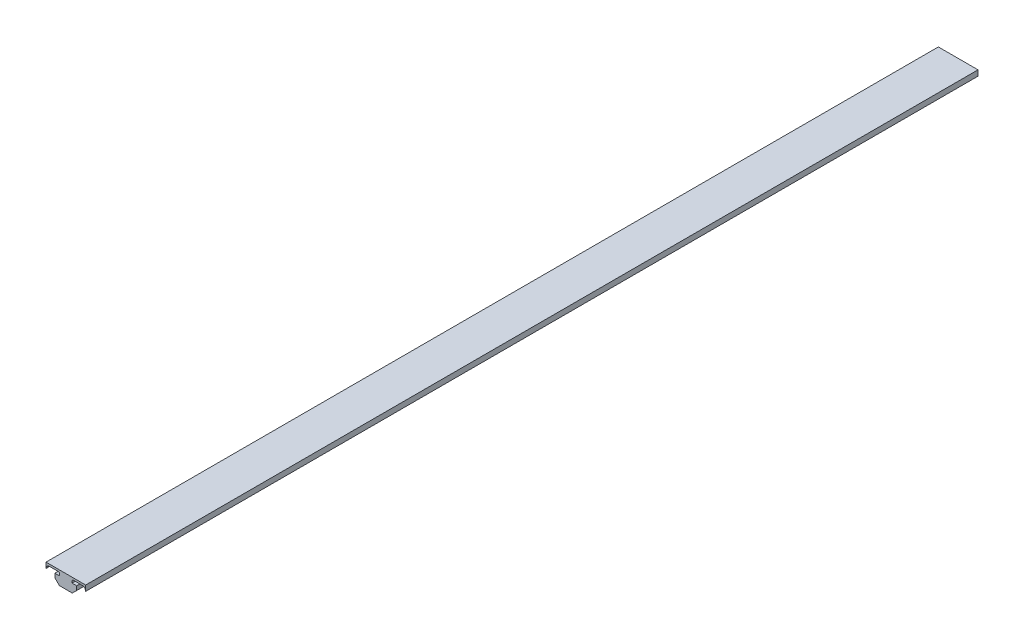
ISO-10303-21;
HEADER;
FILE_DESCRIPTION(('STEP AP214'),'2;1');
FILE_NAME('part.step','',(''),(''),'','','');
FILE_SCHEMA(('AUTOMOTIVE_DESIGN { 1 0 10303 214 1 1 1 1 }'));
ENDSEC;
DATA;
#1=APPLICATION_CONTEXT('core data for automotive mechanical design processes');
#2=APPLICATION_PROTOCOL_DEFINITION('international standard','automotive_design',2000,#1);
#3=PRODUCT_CONTEXT('',#1,'mechanical');
#4=PRODUCT('Part','Part','',(#3));
#5=PRODUCT_RELATED_PRODUCT_CATEGORY('part','',(#4));
#6=PRODUCT_DEFINITION_FORMATION('','',#4);
#7=PRODUCT_DEFINITION_CONTEXT('part definition',#1,'design');
#8=PRODUCT_DEFINITION('design','',#6,#7);
#9=PRODUCT_DEFINITION_SHAPE('','',#8);
#10=(LENGTH_UNIT() NAMED_UNIT(*) SI_UNIT(.MILLI.,.METRE.));
#11=(NAMED_UNIT(*) PLANE_ANGLE_UNIT() SI_UNIT($,.RADIAN.));
#12=(NAMED_UNIT(*) SI_UNIT($,.STERADIAN.) SOLID_ANGLE_UNIT());
#13=UNCERTAINTY_MEASURE_WITH_UNIT(LENGTH_MEASURE(1.E-05),#10,'distance_accuracy_value','');
#14=(GEOMETRIC_REPRESENTATION_CONTEXT(3) GLOBAL_UNCERTAINTY_ASSIGNED_CONTEXT((#13)) GLOBAL_UNIT_ASSIGNED_CONTEXT((#10,
#11,#12)) REPRESENTATION_CONTEXT('',''));
#15=CARTESIAN_POINT('',(0.,0.,0.));
#16=DIRECTION('',(0.,0.,1.));
#17=DIRECTION('',(1.,0.,0.));
#18=AXIS2_PLACEMENT_3D('',#15,#16,#17);
#19=CARTESIAN_POINT('',(8.20999473412484,8.2099947341249,-185.));
#20=DIRECTION('',(0.,0.,1.));
#21=DIRECTION('',(1.,0.,0.));
#22=AXIS2_PLACEMENT_3D('',#19,#20,#21);
#23=PLANE('',#22);
#24=CARTESIAN_POINT('',(8.20999473412484,8.2099947341249,-185.));
#25=DIRECTION('',(0.,0.,-1.));
#26=DIRECTION('',(1.,0.,0.));
#27=AXIS2_PLACEMENT_3D('',#24,#25,#26);
#28=CIRCLE('',#27,1.79000526587516);
#29=CARTESIAN_POINT('',(8.20999473412484,10.0000000000001,-185.));
#30=VERTEX_POINT('',#29);
#31=CARTESIAN_POINT('',(10.,8.2099947341249,-185.));
#32=VERTEX_POINT('',#31);
#33=EDGE_CURVE('E191',#30,#32,#28,.T.);
#34=ORIENTED_EDGE('',*,*,#33,.F.);
#35=DIRECTION('',(1.,0.,0.));
#36=VECTOR('',#35,1.);
#37=CARTESIAN_POINT('',(3.6,10.0000000000001,-185.));
#38=LINE('',#37,#36);
#39=CARTESIAN_POINT('',(3.6,10.0000000000001,-185.));
#40=VERTEX_POINT('',#39);
#41=EDGE_CURVE('E238',#40,#30,#38,.T.);
#42=ORIENTED_EDGE('',*,*,#41,.F.);
#43=DIRECTION('',(0.707106781186544,0.707106781186551,0.));
#44=VECTOR('',#43,1.);
#45=CARTESIAN_POINT('',(3.1,9.50000000000006,-185.));
#46=LINE('',#45,#44);
#47=CARTESIAN_POINT('',(3.1,9.50000000000006,-185.));
#48=VERTEX_POINT('',#47);
#49=EDGE_CURVE('E236',#48,#40,#46,.T.);
#50=ORIENTED_EDGE('',*,*,#49,.F.);
#51=DIRECTION('',(0.,1.,0.));
#52=VECTOR('',#51,1.);
#53=CARTESIAN_POINT('',(3.1,8.40000000000006,-185.));
#54=LINE('',#53,#52);
#55=CARTESIAN_POINT('',(3.1,8.40000000000006,-185.));
#56=VERTEX_POINT('',#55);
#57=EDGE_CURVE('E168',#56,#48,#54,.T.);
#58=ORIENTED_EDGE('',*,*,#57,.F.);
#59=DIRECTION('',(-1.,0.,0.));
#60=VECTOR('',#59,1.);
#61=CARTESIAN_POINT('',(5.5,8.40000000000006,-185.));
#62=LINE('',#61,#60);
#63=CARTESIAN_POINT('',(5.5,8.40000000000006,-185.));
#64=VERTEX_POINT('',#63);
#65=EDGE_CURVE('E232',#64,#56,#62,.T.);
#66=ORIENTED_EDGE('',*,*,#65,.F.);
#67=DIRECTION('',(0.,1.,0.));
#68=VECTOR('',#67,1.);
#69=CARTESIAN_POINT('',(5.5,6.3485281374239,-185.));
#70=LINE('',#69,#68);
#71=CARTESIAN_POINT('',(5.5,6.3485281374239,-185.));
#72=VERTEX_POINT('',#71);
#73=EDGE_CURVE('E229',#72,#64,#70,.T.);
#74=ORIENTED_EDGE('',*,*,#73,.F.);
#75=DIRECTION('',(0.707106781186545,0.70710678118655,0.));
#76=VECTOR('',#75,1.);
#77=CARTESIAN_POINT('',(3.25147186257617,4.10000000000006,-185.));
#78=LINE('',#77,#76);
#79=CARTESIAN_POINT('',(3.25147186257617,4.10000000000006,-185.));
#80=VERTEX_POINT('',#79);
#81=EDGE_CURVE('E226',#80,#72,#78,.T.);
#82=ORIENTED_EDGE('',*,*,#81,.F.);
#83=DIRECTION('',(1.,0.,0.));
#84=VECTOR('',#83,1.);
#85=CARTESIAN_POINT('',(-3.25147186257617,4.10000000000006,-185.));
#86=LINE('',#85,#84);
#87=CARTESIAN_POINT('',(-3.25147186257617,4.10000000000006,-185.));
#88=VERTEX_POINT('',#87);
#89=EDGE_CURVE('E223',#88,#80,#86,.T.);
#90=ORIENTED_EDGE('',*,*,#89,.F.);
#91=DIRECTION('',(0.707106781186545,-0.70710678118655,0.));
#92=VECTOR('',#91,1.);
#93=CARTESIAN_POINT('',(-5.5,6.3485281374239,-185.));
#94=LINE('',#93,#92);
#95=CARTESIAN_POINT('',(-5.5,6.3485281374239,-185.));
#96=VERTEX_POINT('',#95);
#97=EDGE_CURVE('E220',#96,#88,#94,.T.);
#98=ORIENTED_EDGE('',*,*,#97,.F.);
#99=DIRECTION('',(0.,-1.,0.));
#100=VECTOR('',#99,1.);
#101=CARTESIAN_POINT('',(-5.5,8.40000000000006,-185.));
#102=LINE('',#101,#100);
#103=CARTESIAN_POINT('',(-5.5,8.40000000000006,-185.));
#104=VERTEX_POINT('',#103);
#105=EDGE_CURVE('E217',#104,#96,#102,.T.);
#106=ORIENTED_EDGE('',*,*,#105,.F.);
#107=DIRECTION('',(-1.,0.,0.));
#108=VECTOR('',#107,1.);
#109=CARTESIAN_POINT('',(-3.1,8.40000000000006,-185.));
#110=LINE('',#109,#108);
#111=CARTESIAN_POINT('',(-3.1,8.40000000000006,-185.));
#112=VERTEX_POINT('',#111);
#113=EDGE_CURVE('E214',#112,#104,#110,.T.);
#114=ORIENTED_EDGE('',*,*,#113,.F.);
#115=DIRECTION('',(0.,-1.,0.));
#116=VECTOR('',#115,1.);
#117=CARTESIAN_POINT('',(-3.1,9.50000000000006,-185.));
#118=LINE('',#117,#116);
#119=CARTESIAN_POINT('',(-3.1,9.50000000000006,-185.));
#120=VERTEX_POINT('',#119);
#121=EDGE_CURVE('E211',#120,#112,#118,.T.);
#122=ORIENTED_EDGE('',*,*,#121,.F.);
#123=DIRECTION('',(0.707106781186544,-0.707106781186551,0.));
#124=VECTOR('',#123,1.);
#125=CARTESIAN_POINT('',(-3.6,10.0000000000001,-185.));
#126=LINE('',#125,#124);
#127=CARTESIAN_POINT('',(-3.6,10.0000000000001,-185.));
#128=VERTEX_POINT('',#127);
#129=EDGE_CURVE('E208',#128,#120,#126,.T.);
#130=ORIENTED_EDGE('',*,*,#129,.F.);
#131=DIRECTION('',(1.,0.,0.));
#132=VECTOR('',#131,1.);
#133=CARTESIAN_POINT('',(-8.20999473412484,10.0000000000001,-185.));
#134=LINE('',#133,#132);
#135=CARTESIAN_POINT('',(-8.20999473412484,10.0000000000001,-185.));
#136=VERTEX_POINT('',#135);
#137=EDGE_CURVE('E205',#136,#128,#134,.T.);
#138=ORIENTED_EDGE('',*,*,#137,.F.);
#139=CARTESIAN_POINT('',(-8.20999473412484,8.2099947341249,-185.));
#140=DIRECTION('',(0.,0.,-1.));
#141=DIRECTION('',(1.,0.,0.));
#142=AXIS2_PLACEMENT_3D('',#139,#140,#141);
#143=CIRCLE('',#142,1.79000526587516);
#144=CARTESIAN_POINT('',(-10.,8.2099947341249,-185.));
#145=VERTEX_POINT('',#144);
#146=EDGE_CURVE('E202',#145,#136,#143,.T.);
#147=ORIENTED_EDGE('',*,*,#146,.F.);
#148=DIRECTION('',(0.,-1.,0.));
#149=VECTOR('',#148,1.);
#150=CARTESIAN_POINT('',(-10.,11.0000000000001,-185.));
#151=LINE('',#150,#149);
#152=CARTESIAN_POINT('',(-10.,11.0000000000001,-185.));
#153=VERTEX_POINT('',#152);
#154=EDGE_CURVE('E199',#153,#145,#151,.T.);
#155=ORIENTED_EDGE('',*,*,#154,.F.);
#156=DIRECTION('',(-1.,0.,0.));
#157=VECTOR('',#156,1.);
#158=CARTESIAN_POINT('',(10.,11.0000000000001,-185.));
#159=LINE('',#158,#157);
#160=CARTESIAN_POINT('',(10.,11.0000000000001,-185.));
#161=VERTEX_POINT('',#160);
#162=EDGE_CURVE('E196',#161,#153,#159,.T.);
#163=ORIENTED_EDGE('',*,*,#162,.F.);
#164=DIRECTION('',(0.,1.,0.));
#165=VECTOR('',#164,1.);
#166=CARTESIAN_POINT('',(10.,8.2099947341249,-185.));
#167=LINE('',#166,#165);
#168=EDGE_CURVE('E193',#32,#161,#167,.T.);
#169=ORIENTED_EDGE('',*,*,#168,.F.);
#170=EDGE_LOOP('',(#34,#42,#50,#58,#66,#74,#82,#90,#98,#106,#114,#122,#130,#138,#147,#155,#163,#169));
#171=FACE_BOUND('',#170,.T.);
#172=ADVANCED_FACE('F35',(#171),#23,.F.);
#173=CARTESIAN_POINT('',(-10.,0.,-40.));
#174=DIRECTION('',(-1.,0.,0.));
#175=DIRECTION('',(0.,0.,1.));
#176=AXIS2_PLACEMENT_3D('',#173,#174,#175);
#177=PLANE('',#176);
#178=DIRECTION('',(0.,0.,1.));
#179=VECTOR('',#178,1.);
#180=CARTESIAN_POINT('',(-10.,11.0000000000001,-40.));
#181=LINE('',#180,#179);
#182=CARTESIAN_POINT('',(-10.,11.0000000000001,265.));
#183=VERTEX_POINT('',#182);
#184=EDGE_CURVE('E187',#153,#183,#181,.T.);
#185=ORIENTED_EDGE('',*,*,#184,.F.);
#186=ORIENTED_EDGE('',*,*,#154,.T.);
#187=DIRECTION('',(0.,0.,-1.));
#188=VECTOR('',#187,1.);
#189=CARTESIAN_POINT('',(-10.,8.2099947341249,40.));
#190=LINE('',#189,#188);
#191=CARTESIAN_POINT('',(-10.,8.2099947341249,265.));
#192=VERTEX_POINT('',#191);
#193=EDGE_CURVE('E39',#192,#145,#190,.T.);
#194=ORIENTED_EDGE('',*,*,#193,.F.);
#195=DIRECTION('',(0.,-1.,0.));
#196=VECTOR('',#195,1.);
#197=CARTESIAN_POINT('',(-10.,11.0000000000001,265.));
#198=LINE('',#197,#196);
#199=EDGE_CURVE('E291',#183,#192,#198,.T.);
#200=ORIENTED_EDGE('',*,*,#199,.F.);
#201=EDGE_LOOP('',(#185,#186,#194,#200));
#202=FACE_BOUND('',#201,.T.);
#203=ADVANCED_FACE('F37',(#202),#177,.T.);
#204=CARTESIAN_POINT('',(-10.,11.0000000000001,-40.));
#205=DIRECTION('',(0.,1.,0.));
#206=DIRECTION('',(0.,0.,1.));
#207=AXIS2_PLACEMENT_3D('',#204,#205,#206);
#208=PLANE('',#207);
#209=ORIENTED_EDGE('',*,*,#184,.T.);
#210=DIRECTION('',(-1.,0.,0.));
#211=VECTOR('',#210,1.);
#212=CARTESIAN_POINT('',(10.,11.0000000000001,265.));
#213=LINE('',#212,#211);
#214=CARTESIAN_POINT('',(10.,11.0000000000001,265.));
#215=VERTEX_POINT('',#214);
#216=EDGE_CURVE('E295',#215,#183,#213,.T.);
#217=ORIENTED_EDGE('',*,*,#216,.F.);
#218=DIRECTION('',(0.,0.,1.));
#219=VECTOR('',#218,1.);
#220=CARTESIAN_POINT('',(10.,11.0000000000001,-40.));
#221=LINE('',#220,#219);
#222=EDGE_CURVE('E241',#161,#215,#221,.T.);
#223=ORIENTED_EDGE('',*,*,#222,.F.);
#224=ORIENTED_EDGE('',*,*,#162,.T.);
#225=EDGE_LOOP('',(#209,#217,#223,#224));
#226=FACE_BOUND('',#225,.T.);
#227=ADVANCED_FACE('F343',(#226),#208,.T.);
#228=CARTESIAN_POINT('',(10.,0.,-40.));
#229=DIRECTION('',(1.,0.,0.));
#230=DIRECTION('',(0.,1.,0.));
#231=AXIS2_PLACEMENT_3D('',#228,#229,#230);
#232=PLANE('',#231);
#233=DIRECTION('',(0.,0.,-1.));
#234=VECTOR('',#233,1.);
#235=CARTESIAN_POINT('',(10.,8.2099947341249,40.));
#236=LINE('',#235,#234);
#237=CARTESIAN_POINT('',(10.,8.2099947341249,265.));
#238=VERTEX_POINT('',#237);
#239=EDGE_CURVE('E116',#238,#32,#236,.T.);
#240=ORIENTED_EDGE('',*,*,#239,.T.);
#241=ORIENTED_EDGE('',*,*,#168,.T.);
#242=ORIENTED_EDGE('',*,*,#222,.T.);
#243=DIRECTION('',(0.,1.,0.));
#244=VECTOR('',#243,1.);
#245=CARTESIAN_POINT('',(10.,8.2099947341249,265.));
#246=LINE('',#245,#244);
#247=EDGE_CURVE('E356',#238,#215,#246,.T.);
#248=ORIENTED_EDGE('',*,*,#247,.F.);
#249=EDGE_LOOP('',(#240,#241,#242,#248));
#250=FACE_BOUND('',#249,.T.);
#251=ADVANCED_FACE('F347',(#250),#232,.T.);
#252=CARTESIAN_POINT('',(-3.25147186257617,4.10000000000006,40.));
#253=DIRECTION('',(-0.70710678118655,-0.707106781186545,0.));
#254=DIRECTION('',(-0.707106781186545,0.70710678118655,0.));
#255=AXIS2_PLACEMENT_3D('',#252,#253,#254);
#256=PLANE('',#255);
#257=DIRECTION('',(0.,0.,-1.));
#258=VECTOR('',#257,1.);
#259=CARTESIAN_POINT('',(-5.5,6.3485281374239,40.));
#260=LINE('',#259,#258);
#261=CARTESIAN_POINT('',(-5.5,6.3485281374239,265.));
#262=VERTEX_POINT('',#261);
#263=EDGE_CURVE('E243',#262,#96,#260,.T.);
#264=ORIENTED_EDGE('',*,*,#263,.T.);
#265=ORIENTED_EDGE('',*,*,#97,.T.);
#266=DIRECTION('',(0.,0.,-1.));
#267=VECTOR('',#266,1.);
#268=CARTESIAN_POINT('',(-3.25147186257617,4.10000000000006,40.));
#269=LINE('',#268,#267);
#270=CARTESIAN_POINT('',(-3.25147186257617,4.10000000000006,265.));
#271=VERTEX_POINT('',#270);
#272=EDGE_CURVE('E253',#271,#88,#269,.T.);
#273=ORIENTED_EDGE('',*,*,#272,.F.);
#274=DIRECTION('',(0.707106781186545,-0.70710678118655,0.));
#275=VECTOR('',#274,1.);
#276=CARTESIAN_POINT('',(-5.5,6.3485281374239,265.));
#277=LINE('',#276,#275);
#278=EDGE_CURVE('E309',#262,#271,#277,.T.);
#279=ORIENTED_EDGE('',*,*,#278,.F.);
#280=EDGE_LOOP('',(#264,#265,#273,#279));
#281=FACE_BOUND('',#280,.T.);
#282=ADVANCED_FACE('F352',(#281),#256,.T.);
#283=CARTESIAN_POINT('',(-5.5,6.3485281374239,40.));
#284=DIRECTION('',(-1.,0.,0.));
#285=DIRECTION('',(0.,0.,-1.));
#286=AXIS2_PLACEMENT_3D('',#283,#284,#285);
#287=PLANE('',#286);
#288=DIRECTION('',(0.,0.,-1.));
#289=VECTOR('',#288,1.);
#290=CARTESIAN_POINT('',(-5.5,8.40000000000006,40.));
#291=LINE('',#290,#289);
#292=CARTESIAN_POINT('',(-5.5,8.40000000000006,265.));
#293=VERTEX_POINT('',#292);
#294=EDGE_CURVE('E263',#293,#104,#291,.T.);
#295=ORIENTED_EDGE('',*,*,#294,.T.);
#296=ORIENTED_EDGE('',*,*,#105,.T.);
#297=ORIENTED_EDGE('',*,*,#263,.F.);
#298=DIRECTION('',(0.,-1.,0.));
#299=VECTOR('',#298,1.);
#300=CARTESIAN_POINT('',(-5.5,8.40000000000006,265.));
#301=LINE('',#300,#299);
#302=EDGE_CURVE('E306',#293,#262,#301,.T.);
#303=ORIENTED_EDGE('',*,*,#302,.F.);
#304=EDGE_LOOP('',(#295,#296,#297,#303));
#305=FACE_BOUND('',#304,.T.);
#306=ADVANCED_FACE('F362',(#305),#287,.T.);
#307=CARTESIAN_POINT('',(-5.5,8.40000000000006,40.));
#308=DIRECTION('',(0.,1.,0.));
#309=DIRECTION('',(0.,0.,1.));
#310=AXIS2_PLACEMENT_3D('',#307,#308,#309);
#311=PLANE('',#310);
#312=DIRECTION('',(0.,0.,-1.));
#313=VECTOR('',#312,1.);
#314=CARTESIAN_POINT('',(-3.1,8.40000000000006,40.));
#315=LINE('',#314,#313);
#316=CARTESIAN_POINT('',(-3.1,8.40000000000006,265.));
#317=VERTEX_POINT('',#316);
#318=EDGE_CURVE('E261',#317,#112,#315,.T.);
#319=ORIENTED_EDGE('',*,*,#318,.T.);
#320=ORIENTED_EDGE('',*,*,#113,.T.);
#321=ORIENTED_EDGE('',*,*,#294,.F.);
#322=DIRECTION('',(-1.,0.,0.));
#323=VECTOR('',#322,1.);
#324=CARTESIAN_POINT('',(-3.1,8.40000000000006,265.));
#325=LINE('',#324,#323);
#326=EDGE_CURVE('E303',#317,#293,#325,.T.);
#327=ORIENTED_EDGE('',*,*,#326,.F.);
#328=EDGE_LOOP('',(#319,#320,#321,#327));
#329=FACE_BOUND('',#328,.T.);
#330=ADVANCED_FACE('F368',(#329),#311,.T.);
#331=CARTESIAN_POINT('',(-3.1,8.40000000000006,40.));
#332=DIRECTION('',(-1.,0.,0.));
#333=DIRECTION('',(0.,0.,-1.));
#334=AXIS2_PLACEMENT_3D('',#331,#332,#333);
#335=PLANE('',#334);
#336=DIRECTION('',(0.,0.,-1.));
#337=VECTOR('',#336,1.);
#338=CARTESIAN_POINT('',(-3.1,9.50000000000006,40.));
#339=LINE('',#338,#337);
#340=CARTESIAN_POINT('',(-3.1,9.50000000000006,265.));
#341=VERTEX_POINT('',#340);
#342=EDGE_CURVE('E259',#341,#120,#339,.T.);
#343=ORIENTED_EDGE('',*,*,#342,.T.);
#344=ORIENTED_EDGE('',*,*,#121,.T.);
#345=ORIENTED_EDGE('',*,*,#318,.F.);
#346=DIRECTION('',(0.,-1.,0.));
#347=VECTOR('',#346,1.);
#348=CARTESIAN_POINT('',(-3.1,9.50000000000006,265.));
#349=LINE('',#348,#347);
#350=EDGE_CURVE('E300',#341,#317,#349,.T.);
#351=ORIENTED_EDGE('',*,*,#350,.F.);
#352=EDGE_LOOP('',(#343,#344,#345,#351));
#353=FACE_BOUND('',#352,.T.);
#354=ADVANCED_FACE('F372',(#353),#335,.T.);
#355=CARTESIAN_POINT('',(-3.1,9.50000000000006,40.));
#356=DIRECTION('',(-0.70710678118655,-0.707106781186545,0.));
#357=DIRECTION('',(-0.707106781186545,0.70710678118655,0.));
#358=AXIS2_PLACEMENT_3D('',#355,#356,#357);
#359=PLANE('',#358);
#360=DIRECTION('',(0.,0.,-1.));
#361=VECTOR('',#360,1.);
#362=CARTESIAN_POINT('',(-3.6,10.0000000000001,40.));
#363=LINE('',#362,#361);
#364=CARTESIAN_POINT('',(-3.6,10.0000000000001,265.));
#365=VERTEX_POINT('',#364);
#366=EDGE_CURVE('E257',#365,#128,#363,.T.);
#367=ORIENTED_EDGE('',*,*,#366,.T.);
#368=ORIENTED_EDGE('',*,*,#129,.T.);
#369=ORIENTED_EDGE('',*,*,#342,.F.);
#370=DIRECTION('',(0.707106781186544,-0.707106781186551,0.));
#371=VECTOR('',#370,1.);
#372=CARTESIAN_POINT('',(-3.6,10.0000000000001,265.));
#373=LINE('',#372,#371);
#374=EDGE_CURVE('E293',#365,#341,#373,.T.);
#375=ORIENTED_EDGE('',*,*,#374,.F.);
#376=EDGE_LOOP('',(#367,#368,#369,#375));
#377=FACE_BOUND('',#376,.T.);
#378=ADVANCED_FACE('F376',(#377),#359,.T.);
#379=CARTESIAN_POINT('',(-3.6,10.0000000000001,40.));
#380=DIRECTION('',(0.,-1.,0.));
#381=DIRECTION('',(0.,0.,-1.));
#382=AXIS2_PLACEMENT_3D('',#379,#380,#381);
#383=PLANE('',#382);
#384=DIRECTION('',(0.,0.,-1.));
#385=VECTOR('',#384,1.);
#386=CARTESIAN_POINT('',(-8.20999473412484,10.0000000000001,40.));
#387=LINE('',#386,#385);
#388=CARTESIAN_POINT('',(-8.20999473412484,10.0000000000001,265.));
#389=VERTEX_POINT('',#388);
#390=EDGE_CURVE('E255',#389,#136,#387,.T.);
#391=ORIENTED_EDGE('',*,*,#390,.T.);
#392=ORIENTED_EDGE('',*,*,#137,.T.);
#393=ORIENTED_EDGE('',*,*,#366,.F.);
#394=DIRECTION('',(1.,0.,0.));
#395=VECTOR('',#394,1.);
#396=CARTESIAN_POINT('',(-8.20999473412484,10.0000000000001,265.));
#397=LINE('',#396,#395);
#398=EDGE_CURVE('E287',#389,#365,#397,.T.);
#399=ORIENTED_EDGE('',*,*,#398,.F.);
#400=EDGE_LOOP('',(#391,#392,#393,#399));
#401=FACE_BOUND('',#400,.T.);
#402=ADVANCED_FACE('F284',(#401),#383,.T.);
#403=CARTESIAN_POINT('',(-8.20999473412484,8.2099947341249,40.));
#404=DIRECTION('',(0.,0.,-1.));
#405=DIRECTION('',(1.,0.,0.));
#406=AXIS2_PLACEMENT_3D('',#403,#404,#405);
#407=CYLINDRICAL_SURFACE('',#406,1.79000526587516);
#408=ORIENTED_EDGE('',*,*,#193,.T.);
#409=ORIENTED_EDGE('',*,*,#146,.T.);
#410=ORIENTED_EDGE('',*,*,#390,.F.);
#411=CARTESIAN_POINT('',(-8.20999473412484,8.2099947341249,265.));
#412=DIRECTION('',(0.,0.,-1.));
#413=DIRECTION('',(1.,0.,0.));
#414=AXIS2_PLACEMENT_3D('',#411,#412,#413);
#415=CIRCLE('',#414,1.79000526587516);
#416=EDGE_CURVE('E273',#192,#389,#415,.T.);
#417=ORIENTED_EDGE('',*,*,#416,.F.);
#418=EDGE_LOOP('',(#408,#409,#410,#417));
#419=FACE_BOUND('',#418,.T.);
#420=ADVANCED_FACE('F269',(#419),#407,.F.);
#421=CARTESIAN_POINT('',(0.,4.10000000000006,40.));
#422=DIRECTION('',(0.,-1.,0.));
#423=DIRECTION('',(1.,0.,0.));
#424=AXIS2_PLACEMENT_3D('',#421,#422,#423);
#425=PLANE('',#424);
#426=ORIENTED_EDGE('',*,*,#272,.T.);
#427=ORIENTED_EDGE('',*,*,#89,.T.);
#428=DIRECTION('',(0.,0.,-1.));
#429=VECTOR('',#428,1.);
#430=CARTESIAN_POINT('',(3.25147186257617,4.10000000000006,40.));
#431=LINE('',#430,#429);
#432=CARTESIAN_POINT('',(3.25147186257617,4.10000000000006,265.));
#433=VERTEX_POINT('',#432);
#434=EDGE_CURVE('E251',#433,#80,#431,.T.);
#435=ORIENTED_EDGE('',*,*,#434,.F.);
#436=DIRECTION('',(1.,0.,0.));
#437=VECTOR('',#436,1.);
#438=CARTESIAN_POINT('',(-3.25147186257617,4.10000000000006,265.));
#439=LINE('',#438,#437);
#440=EDGE_CURVE('E312',#271,#433,#439,.T.);
#441=ORIENTED_EDGE('',*,*,#440,.F.);
#442=EDGE_LOOP('',(#426,#427,#435,#441));
#443=FACE_BOUND('',#442,.T.);
#444=ADVANCED_FACE('F385',(#443),#425,.T.);
#445=CARTESIAN_POINT('',(3.25147186257617,4.10000000000006,40.));
#446=DIRECTION('',(0.70710678118655,-0.707106781186545,0.));
#447=DIRECTION('',(0.707106781186545,0.70710678118655,0.));
#448=AXIS2_PLACEMENT_3D('',#445,#446,#447);
#449=PLANE('',#448);
#450=ORIENTED_EDGE('',*,*,#434,.T.);
#451=ORIENTED_EDGE('',*,*,#81,.T.);
#452=DIRECTION('',(0.,0.,-1.));
#453=VECTOR('',#452,1.);
#454=CARTESIAN_POINT('',(5.5,6.3485281374239,40.));
#455=LINE('',#454,#453);
#456=CARTESIAN_POINT('',(5.5,6.3485281374239,265.));
#457=VERTEX_POINT('',#456);
#458=EDGE_CURVE('E249',#457,#72,#455,.T.);
#459=ORIENTED_EDGE('',*,*,#458,.F.);
#460=DIRECTION('',(0.707106781186545,0.70710678118655,0.));
#461=VECTOR('',#460,1.);
#462=CARTESIAN_POINT('',(3.25147186257617,4.10000000000006,265.));
#463=LINE('',#462,#461);
#464=EDGE_CURVE('E315',#433,#457,#463,.T.);
#465=ORIENTED_EDGE('',*,*,#464,.F.);
#466=EDGE_LOOP('',(#450,#451,#459,#465));
#467=FACE_BOUND('',#466,.T.);
#468=ADVANCED_FACE('F388',(#467),#449,.T.);
#469=CARTESIAN_POINT('',(5.5,6.3485281374239,40.));
#470=DIRECTION('',(1.,0.,0.));
#471=DIRECTION('',(0.,0.,-1.));
#472=AXIS2_PLACEMENT_3D('',#469,#470,#471);
#473=PLANE('',#472);
#474=ORIENTED_EDGE('',*,*,#458,.T.);
#475=ORIENTED_EDGE('',*,*,#73,.T.);
#476=DIRECTION('',(0.,0.,-1.));
#477=VECTOR('',#476,1.);
#478=CARTESIAN_POINT('',(5.5,8.40000000000006,40.));
#479=LINE('',#478,#477);
#480=CARTESIAN_POINT('',(5.5,8.40000000000006,265.));
#481=VERTEX_POINT('',#480);
#482=EDGE_CURVE('E247',#481,#64,#479,.T.);
#483=ORIENTED_EDGE('',*,*,#482,.F.);
#484=DIRECTION('',(0.,1.,0.));
#485=VECTOR('',#484,1.);
#486=CARTESIAN_POINT('',(5.5,6.3485281374239,265.));
#487=LINE('',#486,#485);
#488=EDGE_CURVE('E318',#457,#481,#487,.T.);
#489=ORIENTED_EDGE('',*,*,#488,.F.);
#490=EDGE_LOOP('',(#474,#475,#483,#489));
#491=FACE_BOUND('',#490,.T.);
#492=ADVANCED_FACE('F391',(#491),#473,.T.);
#493=CARTESIAN_POINT('',(5.5,8.40000000000006,40.));
#494=DIRECTION('',(0.,1.,0.));
#495=DIRECTION('',(0.,0.,1.));
#496=AXIS2_PLACEMENT_3D('',#493,#494,#495);
#497=PLANE('',#496);
#498=ORIENTED_EDGE('',*,*,#482,.T.);
#499=ORIENTED_EDGE('',*,*,#65,.T.);
#500=DIRECTION('',(0.,0.,-1.));
#501=VECTOR('',#500,1.);
#502=CARTESIAN_POINT('',(3.1,8.40000000000006,40.));
#503=LINE('',#502,#501);
#504=CARTESIAN_POINT('',(3.1,8.40000000000006,265.));
#505=VERTEX_POINT('',#504);
#506=EDGE_CURVE('E172',#505,#56,#503,.T.);
#507=ORIENTED_EDGE('',*,*,#506,.F.);
#508=DIRECTION('',(-1.,0.,0.));
#509=VECTOR('',#508,1.);
#510=CARTESIAN_POINT('',(5.5,8.40000000000006,265.));
#511=LINE('',#510,#509);
#512=EDGE_CURVE('E182',#481,#505,#511,.T.);
#513=ORIENTED_EDGE('',*,*,#512,.F.);
#514=EDGE_LOOP('',(#498,#499,#507,#513));
#515=FACE_BOUND('',#514,.T.);
#516=ADVANCED_FACE('F323',(#515),#497,.T.);
#517=CARTESIAN_POINT('',(3.1,8.40000000000006,40.));
#518=DIRECTION('',(1.,0.,0.));
#519=DIRECTION('',(0.,0.,-1.));
#520=AXIS2_PLACEMENT_3D('',#517,#518,#519);
#521=PLANE('',#520);
#522=ORIENTED_EDGE('',*,*,#506,.T.);
#523=ORIENTED_EDGE('',*,*,#57,.T.);
#524=DIRECTION('',(0.,0.,-1.));
#525=VECTOR('',#524,1.);
#526=CARTESIAN_POINT('',(3.1,9.50000000000006,40.));
#527=LINE('',#526,#525);
#528=CARTESIAN_POINT('',(3.1,9.50000000000006,265.));
#529=VERTEX_POINT('',#528);
#530=EDGE_CURVE('E163',#529,#48,#527,.T.);
#531=ORIENTED_EDGE('',*,*,#530,.F.);
#532=DIRECTION('',(0.,1.,0.));
#533=VECTOR('',#532,1.);
#534=CARTESIAN_POINT('',(3.1,8.40000000000006,265.));
#535=LINE('',#534,#533);
#536=EDGE_CURVE('E166',#505,#529,#535,.T.);
#537=ORIENTED_EDGE('',*,*,#536,.F.);
#538=EDGE_LOOP('',(#522,#523,#531,#537));
#539=FACE_BOUND('',#538,.T.);
#540=ADVANCED_FACE('F165',(#539),#521,.T.);
#541=CARTESIAN_POINT('',(3.1,9.50000000000006,40.));
#542=DIRECTION('',(0.70710678118655,-0.707106781186545,0.));
#543=DIRECTION('',(0.707106781186545,0.70710678118655,0.));
#544=AXIS2_PLACEMENT_3D('',#541,#542,#543);
#545=PLANE('',#544);
#546=ORIENTED_EDGE('',*,*,#530,.T.);
#547=ORIENTED_EDGE('',*,*,#49,.T.);
#548=DIRECTION('',(0.,0.,-1.));
#549=VECTOR('',#548,1.);
#550=CARTESIAN_POINT('',(3.6,10.0000000000001,40.));
#551=LINE('',#550,#549);
#552=CARTESIAN_POINT('',(3.6,10.0000000000001,265.));
#553=VERTEX_POINT('',#552);
#554=EDGE_CURVE('E45',#553,#40,#551,.T.);
#555=ORIENTED_EDGE('',*,*,#554,.F.);
#556=DIRECTION('',(0.707106781186544,0.707106781186551,0.));
#557=VECTOR('',#556,1.);
#558=CARTESIAN_POINT('',(3.1,9.50000000000006,265.));
#559=LINE('',#558,#557);
#560=EDGE_CURVE('E179',#529,#553,#559,.T.);
#561=ORIENTED_EDGE('',*,*,#560,.F.);
#562=EDGE_LOOP('',(#546,#547,#555,#561));
#563=FACE_BOUND('',#562,.T.);
#564=ADVANCED_FACE('F184',(#563),#545,.T.);
#565=CARTESIAN_POINT('',(3.6,10.0000000000001,40.));
#566=DIRECTION('',(0.,-1.,0.));
#567=DIRECTION('',(0.,0.,-1.));
#568=AXIS2_PLACEMENT_3D('',#565,#566,#567);
#569=PLANE('',#568);
#570=ORIENTED_EDGE('',*,*,#554,.T.);
#571=ORIENTED_EDGE('',*,*,#41,.T.);
#572=DIRECTION('',(0.,0.,-1.));
#573=VECTOR('',#572,1.);
#574=CARTESIAN_POINT('',(8.20999473412484,10.0000000000001,40.));
#575=LINE('',#574,#573);
#576=CARTESIAN_POINT('',(8.20999473412484,10.0000000000001,265.));
#577=VERTEX_POINT('',#576);
#578=EDGE_CURVE('E11',#577,#30,#575,.T.);
#579=ORIENTED_EDGE('',*,*,#578,.F.);
#580=DIRECTION('',(1.,0.,0.));
#581=VECTOR('',#580,1.);
#582=CARTESIAN_POINT('',(3.6,10.0000000000001,265.));
#583=LINE('',#582,#581);
#584=EDGE_CURVE('E185',#553,#577,#583,.T.);
#585=ORIENTED_EDGE('',*,*,#584,.F.);
#586=EDGE_LOOP('',(#570,#571,#579,#585));
#587=FACE_BOUND('',#586,.T.);
#588=ADVANCED_FACE('F328',(#587),#569,.T.);
#589=CARTESIAN_POINT('',(8.20999473412484,8.2099947341249,40.));
#590=DIRECTION('',(0.,0.,-1.));
#591=DIRECTION('',(-1.,0.,0.));
#592=AXIS2_PLACEMENT_3D('',#589,#590,#591);
#593=CYLINDRICAL_SURFACE('',#592,1.79000526587516);
#594=ORIENTED_EDGE('',*,*,#578,.T.);
#595=ORIENTED_EDGE('',*,*,#33,.T.);
#596=ORIENTED_EDGE('',*,*,#239,.F.);
#597=CARTESIAN_POINT('',(8.20999473412484,8.2099947341249,265.));
#598=DIRECTION('',(0.,0.,-1.));
#599=DIRECTION('',(1.,0.,0.));
#600=AXIS2_PLACEMENT_3D('',#597,#598,#599);
#601=CIRCLE('',#600,1.79000526587516);
#602=EDGE_CURVE('E240',#577,#238,#601,.T.);
#603=ORIENTED_EDGE('',*,*,#602,.F.);
#604=EDGE_LOOP('',(#594,#595,#596,#603));
#605=FACE_BOUND('',#604,.T.);
#606=ADVANCED_FACE('F330',(#605),#593,.F.);
#607=CARTESIAN_POINT('',(8.20999473412484,8.2099947341249,265.));
#608=DIRECTION('',(0.,0.,1.));
#609=DIRECTION('',(1.,0.,0.));
#610=AXIS2_PLACEMENT_3D('',#607,#608,#609);
#611=PLANE('',#610);
#612=ORIENTED_EDGE('',*,*,#602,.T.);
#613=ORIENTED_EDGE('',*,*,#247,.T.);
#614=ORIENTED_EDGE('',*,*,#216,.T.);
#615=ORIENTED_EDGE('',*,*,#199,.T.);
#616=ORIENTED_EDGE('',*,*,#416,.T.);
#617=ORIENTED_EDGE('',*,*,#398,.T.);
#618=ORIENTED_EDGE('',*,*,#374,.T.);
#619=ORIENTED_EDGE('',*,*,#350,.T.);
#620=ORIENTED_EDGE('',*,*,#326,.T.);
#621=ORIENTED_EDGE('',*,*,#302,.T.);
#622=ORIENTED_EDGE('',*,*,#278,.T.);
#623=ORIENTED_EDGE('',*,*,#440,.T.);
#624=ORIENTED_EDGE('',*,*,#464,.T.);
#625=ORIENTED_EDGE('',*,*,#488,.T.);
#626=ORIENTED_EDGE('',*,*,#512,.T.);
#627=ORIENTED_EDGE('',*,*,#536,.T.);
#628=ORIENTED_EDGE('',*,*,#560,.T.);
#629=ORIENTED_EDGE('',*,*,#584,.T.);
#630=EDGE_LOOP('',(#612,#613,#614,#615,#616,#617,#618,#619,#620,#621,#622,#623,#624,#625,#626,
#627,#628,#629));
#631=FACE_BOUND('',#630,.T.);
#632=ADVANCED_FACE('F178',(#631),#611,.T.);
#633=CLOSED_SHELL('',(#172,#203,#227,#251,#282,#306,#330,#354,#378,#402,#420,#444,#468,#492,
#516,#540,#564,#588,#606,#632));
#634=MANIFOLD_SOLID_BREP('B2',#633);
#635=ADVANCED_BREP_SHAPE_REPRESENTATION('',(#18,#634),#14);
#636=SHAPE_DEFINITION_REPRESENTATION(#9,#635);
ENDSEC;
END-ISO-10303-21;
